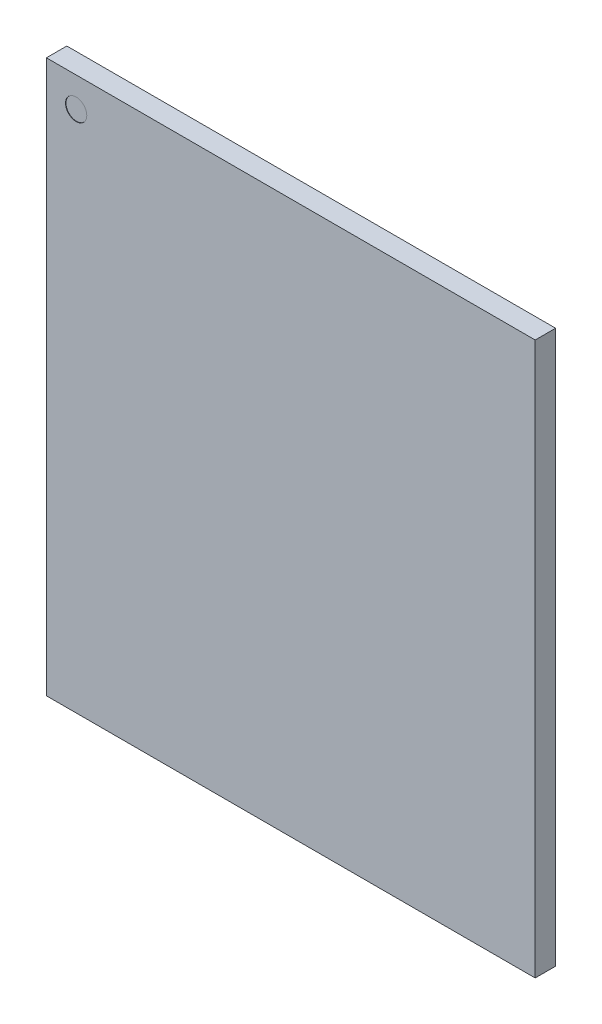
ISO-10303-21;
HEADER;
FILE_DESCRIPTION(('STEP AP214'),'2;1');
FILE_NAME('part.step','',(''),(''),'','','');
FILE_SCHEMA(('AUTOMOTIVE_DESIGN { 1 0 10303 214 1 1 1 1 }'));
ENDSEC;
DATA;
#1=APPLICATION_CONTEXT('core data for automotive mechanical design processes');
#2=APPLICATION_PROTOCOL_DEFINITION('international standard','automotive_design',2000,#1);
#3=PRODUCT_CONTEXT('',#1,'mechanical');
#4=PRODUCT('Part','Part','',(#3));
#5=PRODUCT_RELATED_PRODUCT_CATEGORY('part','',(#4));
#6=PRODUCT_DEFINITION_FORMATION('','',#4);
#7=PRODUCT_DEFINITION_CONTEXT('part definition',#1,'design');
#8=PRODUCT_DEFINITION('design','',#6,#7);
#9=PRODUCT_DEFINITION_SHAPE('','',#8);
#10=(LENGTH_UNIT() NAMED_UNIT(*) SI_UNIT(.MILLI.,.METRE.));
#11=(NAMED_UNIT(*) PLANE_ANGLE_UNIT() SI_UNIT($,.RADIAN.));
#12=(NAMED_UNIT(*) SI_UNIT($,.STERADIAN.) SOLID_ANGLE_UNIT());
#13=UNCERTAINTY_MEASURE_WITH_UNIT(LENGTH_MEASURE(1.E-05),#10,'distance_accuracy_value','');
#14=(GEOMETRIC_REPRESENTATION_CONTEXT(3) GLOBAL_UNCERTAINTY_ASSIGNED_CONTEXT((#13)) GLOBAL_UNIT_ASSIGNED_CONTEXT((#10,
#11,#12)) REPRESENTATION_CONTEXT('',''));
#15=CARTESIAN_POINT('',(0.,0.,0.));
#16=DIRECTION('',(0.,0.,1.));
#17=DIRECTION('',(1.,0.,0.));
#18=AXIS2_PLACEMENT_3D('',#15,#16,#17);
#19=CARTESIAN_POINT('',(0.,-6.4999999999994,0.635));
#20=DIRECTION('',(0.,0.,1.));
#21=DIRECTION('',(1.,0.,0.));
#22=AXIS2_PLACEMENT_3D('',#19,#20,#21);
#23=PLANE('',#22);
#24=CARTESIAN_POINT('',(-5.05000000000012,5.79999999999966,0.635));
#25=DIRECTION('',(0.,0.,1.));
#26=DIRECTION('',(1.,0.,0.));
#27=AXIS2_PLACEMENT_3D('',#24,#25,#26);
#28=CIRCLE('',#27,0.249999999999991);
#29=CARTESIAN_POINT('',(-4.80000000000013,5.79999999999966,0.635));
#30=VERTEX_POINT('',#29);
#31=EDGE_CURVE('E20',#30,#30,#28,.T.);
#32=ORIENTED_EDGE('',*,*,#31,.T.);
#33=EDGE_LOOP('',(#32));
#34=FACE_BOUND('',#33,.T.);
#35=ADVANCED_FACE('F17',(#34),#23,.T.);
#36=CARTESIAN_POINT('',(-5.05000000000012,5.79999999999966,0.64499999999996));
#37=DIRECTION('',(0.,0.,1.));
#38=DIRECTION('',(1.,0.,0.));
#39=AXIS2_PLACEMENT_3D('',#36,#37,#38);
#40=CYLINDRICAL_SURFACE('',#39,0.249999999999991);
#41=ORIENTED_EDGE('',*,*,#31,.F.);
#42=EDGE_LOOP('',(#41));
#43=FACE_BOUND('',#42,.T.);
#44=CARTESIAN_POINT('',(-5.05000000000012,5.79999999999966,0.64499999999996));
#45=DIRECTION('',(0.,0.,1.));
#46=DIRECTION('',(1.,0.,0.));
#47=AXIS2_PLACEMENT_3D('',#44,#45,#46);
#48=CIRCLE('',#47,0.249999999999991);
#49=CARTESIAN_POINT('',(-4.80000000000013,5.79999999999966,0.64499999999996));
#50=VERTEX_POINT('',#49);
#51=EDGE_CURVE('E69',#50,#50,#48,.F.);
#52=ORIENTED_EDGE('',*,*,#51,.F.);
#53=EDGE_LOOP('',(#52));
#54=FACE_BOUND('',#53,.T.);
#55=ADVANCED_FACE('F89',(#43,#54),#40,.F.);
#56=CARTESIAN_POINT('',(-5.74999999999986,-6.4999999999994,0.64499999999996));
#57=DIRECTION('',(0.,0.,1.));
#58=DIRECTION('',(1.,0.,0.));
#59=AXIS2_PLACEMENT_3D('',#56,#57,#58);
#60=PLANE('',#59);
#61=ORIENTED_EDGE('',*,*,#51,.T.);
#62=EDGE_LOOP('',(#61));
#63=FACE_BOUND('',#62,.T.);
#64=DIRECTION('',(0.,1.,0.));
#65=VECTOR('',#64,1.);
#66=CARTESIAN_POINT('',(-5.74999999999986,-6.4999999999994,0.64499999999996));
#67=LINE('',#66,#65);
#68=CARTESIAN_POINT('',(-5.74999999999986,-6.4999999999994,0.64499999999996));
#69=VERTEX_POINT('',#68);
#70=CARTESIAN_POINT('',(-5.74999999999986,6.4999999999994,0.64499999999996));
#71=VERTEX_POINT('',#70);
#72=EDGE_CURVE('E60',#69,#71,#67,.T.);
#73=ORIENTED_EDGE('',*,*,#72,.F.);
#74=DIRECTION('',(1.,0.,0.));
#75=VECTOR('',#74,1.);
#76=CARTESIAN_POINT('',(0.,-6.4999999999994,0.64499999999996));
#77=LINE('',#76,#75);
#78=CARTESIAN_POINT('',(5.74999999999986,-6.4999999999994,0.64499999999996));
#79=VERTEX_POINT('',#78);
#80=EDGE_CURVE('E199',#69,#79,#77,.T.);
#81=ORIENTED_EDGE('',*,*,#80,.T.);
#82=DIRECTION('',(0.,1.,0.));
#83=VECTOR('',#82,1.);
#84=CARTESIAN_POINT('',(5.74999999999986,-6.4999999999994,0.64499999999996));
#85=LINE('',#84,#83);
#86=CARTESIAN_POINT('',(5.74999999999986,6.4999999999994,0.64499999999996));
#87=VERTEX_POINT('',#86);
#88=EDGE_CURVE('E72',#87,#79,#85,.F.);
#89=ORIENTED_EDGE('',*,*,#88,.F.);
#90=DIRECTION('',(1.,0.,0.));
#91=VECTOR('',#90,1.);
#92=CARTESIAN_POINT('',(0.,6.4999999999994,0.64499999999996));
#93=LINE('',#92,#91);
#94=EDGE_CURVE('E55',#71,#87,#93,.T.);
#95=ORIENTED_EDGE('',*,*,#94,.F.);
#96=EDGE_LOOP('',(#73,#81,#89,#95));
#97=FACE_BOUND('',#96,.T.);
#98=ADVANCED_FACE('F71',(#63,#97),#60,.T.);
#99=CARTESIAN_POINT('',(-5.74999999999986,-6.4999999999994,0.165));
#100=DIRECTION('',(-1.,0.,0.));
#101=DIRECTION('',(0.,0.,1.));
#102=AXIS2_PLACEMENT_3D('',#99,#100,#101);
#103=PLANE('',#102);
#104=DIRECTION('',(0.,1.,0.));
#105=VECTOR('',#104,1.);
#106=CARTESIAN_POINT('',(-5.74999999999986,-6.4999999999994,0.165));
#107=LINE('',#106,#105);
#108=CARTESIAN_POINT('',(-5.74999999999986,-6.4999999999994,0.165));
#109=VERTEX_POINT('',#108);
#110=CARTESIAN_POINT('',(-5.74999999999986,6.4999999999994,0.165));
#111=VERTEX_POINT('',#110);
#112=EDGE_CURVE('E200',#109,#111,#107,.T.);
#113=ORIENTED_EDGE('',*,*,#112,.F.);
#114=DIRECTION('',(0.,0.,1.));
#115=VECTOR('',#114,1.);
#116=CARTESIAN_POINT('',(-5.74999999999986,-6.4999999999994,0.));
#117=LINE('',#116,#115);
#118=EDGE_CURVE('E65',#109,#69,#117,.T.);
#119=ORIENTED_EDGE('',*,*,#118,.T.);
#120=ORIENTED_EDGE('',*,*,#72,.T.);
#121=DIRECTION('',(0.,0.,1.));
#122=VECTOR('',#121,1.);
#123=CARTESIAN_POINT('',(-5.74999999999986,6.4999999999994,0.));
#124=LINE('',#123,#122);
#125=EDGE_CURVE('E62',#111,#71,#124,.T.);
#126=ORIENTED_EDGE('',*,*,#125,.F.);
#127=EDGE_LOOP('',(#113,#119,#120,#126));
#128=FACE_BOUND('',#127,.T.);
#129=ADVANCED_FACE('F61',(#128),#103,.T.);
#130=CARTESIAN_POINT('',(0.,6.4999999999994,0.));
#131=DIRECTION('',(0.,1.,0.));
#132=DIRECTION('',(0.,0.,1.));
#133=AXIS2_PLACEMENT_3D('',#130,#131,#132);
#134=PLANE('',#133);
#135=ORIENTED_EDGE('',*,*,#94,.T.);
#136=DIRECTION('',(0.,0.,-1.));
#137=VECTOR('',#136,1.);
#138=CARTESIAN_POINT('',(5.74999999999986,6.4999999999994,0.64499999999996));
#139=LINE('',#138,#137);
#140=CARTESIAN_POINT('',(5.74999999999986,6.4999999999994,0.165));
#141=VERTEX_POINT('',#140);
#142=EDGE_CURVE('E74',#141,#87,#139,.F.);
#143=ORIENTED_EDGE('',*,*,#142,.F.);
#144=DIRECTION('',(-1.,0.,0.));
#145=VECTOR('',#144,1.);
#146=CARTESIAN_POINT('',(5.74999999999986,6.4999999999994,0.165));
#147=LINE('',#146,#145);
#148=EDGE_CURVE('E78',#111,#141,#147,.F.);
#149=ORIENTED_EDGE('',*,*,#148,.F.);
#150=ORIENTED_EDGE('',*,*,#125,.T.);
#151=EDGE_LOOP('',(#135,#143,#149,#150));
#152=FACE_BOUND('',#151,.T.);
#153=ADVANCED_FACE('F76',(#152),#134,.T.);
#154=CARTESIAN_POINT('',(5.74999999999986,-6.4999999999994,0.64499999999996));
#155=DIRECTION('',(1.,0.,0.));
#156=DIRECTION('',(0.,0.,-1.));
#157=AXIS2_PLACEMENT_3D('',#154,#155,#156);
#158=PLANE('',#157);
#159=ORIENTED_EDGE('',*,*,#88,.T.);
#160=DIRECTION('',(0.,0.,1.));
#161=VECTOR('',#160,1.);
#162=CARTESIAN_POINT('',(5.74999999999986,-6.4999999999994,0.));
#163=LINE('',#162,#161);
#164=CARTESIAN_POINT('',(5.74999999999986,-6.4999999999994,0.165));
#165=VERTEX_POINT('',#164);
#166=EDGE_CURVE('E35',#79,#165,#163,.F.);
#167=ORIENTED_EDGE('',*,*,#166,.T.);
#168=DIRECTION('',(0.,1.,0.));
#169=VECTOR('',#168,1.);
#170=CARTESIAN_POINT('',(5.74999999999986,-6.4999999999994,0.165));
#171=LINE('',#170,#169);
#172=EDGE_CURVE('E26',#141,#165,#171,.F.);
#173=ORIENTED_EDGE('',*,*,#172,.F.);
#174=ORIENTED_EDGE('',*,*,#142,.T.);
#175=EDGE_LOOP('',(#159,#167,#173,#174));
#176=FACE_BOUND('',#175,.T.);
#177=ADVANCED_FACE('F106',(#176),#158,.T.);
#178=CARTESIAN_POINT('',(0.,-6.4999999999994,0.));
#179=DIRECTION('',(0.,1.,0.));
#180=DIRECTION('',(0.,0.,1.));
#181=AXIS2_PLACEMENT_3D('',#178,#179,#180);
#182=PLANE('',#181);
#183=ORIENTED_EDGE('',*,*,#118,.F.);
#184=DIRECTION('',(-1.,0.,0.));
#185=VECTOR('',#184,1.);
#186=CARTESIAN_POINT('',(5.74999999999986,-6.4999999999994,0.165));
#187=LINE('',#186,#185);
#188=EDGE_CURVE('E11',#165,#109,#187,.T.);
#189=ORIENTED_EDGE('',*,*,#188,.F.);
#190=ORIENTED_EDGE('',*,*,#166,.F.);
#191=ORIENTED_EDGE('',*,*,#80,.F.);
#192=EDGE_LOOP('',(#183,#189,#190,#191));
#193=FACE_BOUND('',#192,.T.);
#194=ADVANCED_FACE('F100',(#193),#182,.F.);
#195=CARTESIAN_POINT('',(5.74999999999986,-6.4999999999994,0.165));
#196=DIRECTION('',(0.,0.,-1.));
#197=DIRECTION('',(-1.,0.,0.));
#198=AXIS2_PLACEMENT_3D('',#195,#196,#197);
#199=PLANE('',#198);
#200=ORIENTED_EDGE('',*,*,#172,.T.);
#201=ORIENTED_EDGE('',*,*,#188,.T.);
#202=ORIENTED_EDGE('',*,*,#112,.T.);
#203=ORIENTED_EDGE('',*,*,#148,.T.);
#204=EDGE_LOOP('',(#200,#201,#202,#203));
#205=FACE_BOUND('',#204,.T.);
#206=ADVANCED_FACE('F98',(#205),#199,.T.);
#207=CLOSED_SHELL('',(#35,#55,#98,#129,#153,#177,#194,#206));
#208=MANIFOLD_SOLID_BREP('B1',#207);
#209=ADVANCED_BREP_SHAPE_REPRESENTATION('',(#18,#208),#14);
#210=SHAPE_DEFINITION_REPRESENTATION(#9,#209);
ENDSEC;
END-ISO-10303-21;
